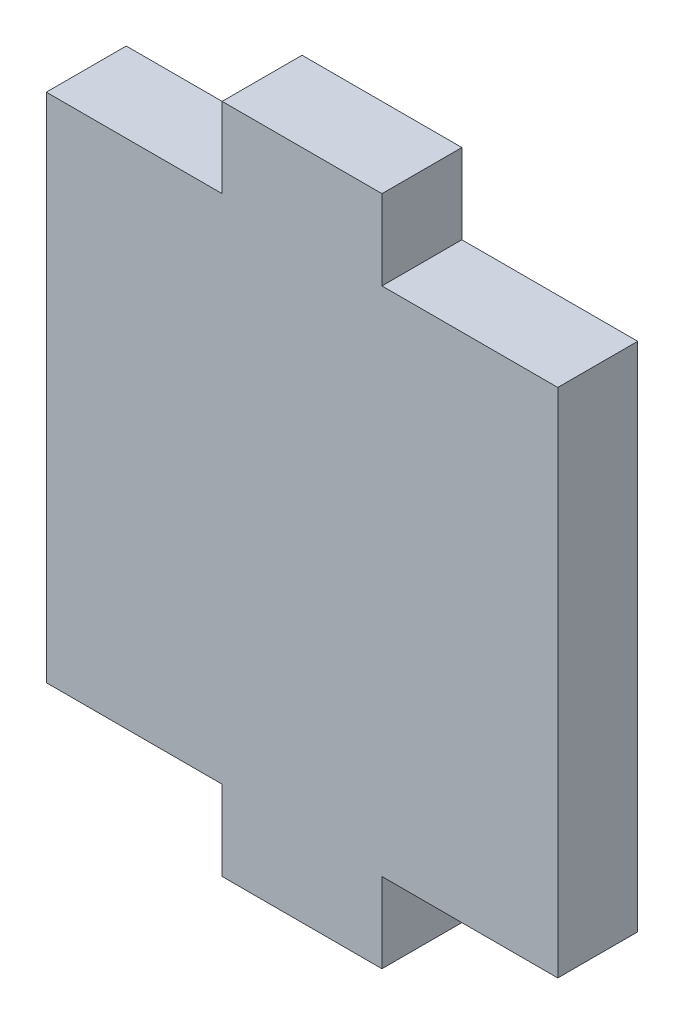
ISO-10303-21;
HEADER;
FILE_DESCRIPTION(('STEP AP214'),'2;1');
FILE_NAME('part.step','',(''),(''),'','','');
FILE_SCHEMA(('AUTOMOTIVE_DESIGN { 1 0 10303 214 1 1 1 1 }'));
ENDSEC;
DATA;
#1=APPLICATION_CONTEXT('core data for automotive mechanical design processes');
#2=APPLICATION_PROTOCOL_DEFINITION('international standard','automotive_design',2000,#1);
#3=PRODUCT_CONTEXT('',#1,'mechanical');
#4=PRODUCT('Part','Part','',(#3));
#5=PRODUCT_RELATED_PRODUCT_CATEGORY('part','',(#4));
#6=PRODUCT_DEFINITION_FORMATION('','',#4);
#7=PRODUCT_DEFINITION_CONTEXT('part definition',#1,'design');
#8=PRODUCT_DEFINITION('design','',#6,#7);
#9=PRODUCT_DEFINITION_SHAPE('','',#8);
#10=(LENGTH_UNIT() NAMED_UNIT(*) SI_UNIT(.MILLI.,.METRE.));
#11=(NAMED_UNIT(*) PLANE_ANGLE_UNIT() SI_UNIT($,.RADIAN.));
#12=(NAMED_UNIT(*) SI_UNIT($,.STERADIAN.) SOLID_ANGLE_UNIT());
#13=UNCERTAINTY_MEASURE_WITH_UNIT(LENGTH_MEASURE(1.E-05),#10,'distance_accuracy_value','');
#14=(GEOMETRIC_REPRESENTATION_CONTEXT(3) GLOBAL_UNCERTAINTY_ASSIGNED_CONTEXT((#13)) GLOBAL_UNIT_ASSIGNED_CONTEXT((#10,
#11,#12)) REPRESENTATION_CONTEXT('',''));
#15=CARTESIAN_POINT('',(0.,0.,0.));
#16=DIRECTION('',(0.,0.,1.));
#17=DIRECTION('',(1.,0.,0.));
#18=AXIS2_PLACEMENT_3D('',#15,#16,#17);
#19=CARTESIAN_POINT('',(-10.16,9.36625,3.175));
#20=DIRECTION('',(1.,0.,0.));
#21=DIRECTION('',(0.,1.,0.));
#22=AXIS2_PLACEMENT_3D('',#19,#20,#21);
#23=PLANE('',#22);
#24=DIRECTION('',(0.,-1.,0.));
#25=VECTOR('',#24,1.);
#26=CARTESIAN_POINT('',(-10.16,9.36625,0.));
#27=LINE('',#26,#25);
#28=CARTESIAN_POINT('',(-10.16,9.36625,0.));
#29=VERTEX_POINT('',#28);
#30=CARTESIAN_POINT('',(-10.16,-10.95375,0.));
#31=VERTEX_POINT('',#30);
#32=EDGE_CURVE('E155',#29,#31,#27,.T.);
#33=ORIENTED_EDGE('',*,*,#32,.T.);
#34=DIRECTION('',(0.,0.,-1.));
#35=VECTOR('',#34,1.);
#36=CARTESIAN_POINT('',(-10.16,-10.95375,3.175));
#37=LINE('',#36,#35);
#38=CARTESIAN_POINT('',(-10.16,-10.95375,3.175));
#39=VERTEX_POINT('',#38);
#40=EDGE_CURVE('E11',#39,#31,#37,.T.);
#41=ORIENTED_EDGE('',*,*,#40,.F.);
#42=DIRECTION('',(0.,-1.,0.));
#43=VECTOR('',#42,1.);
#44=CARTESIAN_POINT('',(-10.16,9.36625,3.175));
#45=LINE('',#44,#43);
#46=CARTESIAN_POINT('',(-10.16,9.36625,3.175));
#47=VERTEX_POINT('',#46);
#48=EDGE_CURVE('E177',#47,#39,#45,.T.);
#49=ORIENTED_EDGE('',*,*,#48,.F.);
#50=DIRECTION('',(0.,0.,-1.));
#51=VECTOR('',#50,1.);
#52=CARTESIAN_POINT('',(-10.16,9.36625,3.175));
#53=LINE('',#52,#51);
#54=EDGE_CURVE('E151',#47,#29,#53,.T.);
#55=ORIENTED_EDGE('',*,*,#54,.T.);
#56=EDGE_LOOP('',(#33,#41,#49,#55));
#57=FACE_BOUND('',#56,.T.);
#58=ADVANCED_FACE('F35',(#57),#23,.F.);
#59=CARTESIAN_POINT('',(-10.16,-10.95375,3.175));
#60=DIRECTION('',(0.,1.,0.));
#61=DIRECTION('',(-1.,0.,0.));
#62=AXIS2_PLACEMENT_3D('',#59,#60,#61);
#63=PLANE('',#62);
#64=DIRECTION('',(1.,0.,0.));
#65=VECTOR('',#64,1.);
#66=CARTESIAN_POINT('',(-10.16,-10.95375,0.));
#67=LINE('',#66,#65);
#68=CARTESIAN_POINT('',(-3.17500000000001,-10.95375,0.));
#69=VERTEX_POINT('',#68);
#70=EDGE_CURVE('E158',#31,#69,#67,.T.);
#71=ORIENTED_EDGE('',*,*,#70,.T.);
#72=DIRECTION('',(0.,0.,-1.));
#73=VECTOR('',#72,1.);
#74=CARTESIAN_POINT('',(-3.17500000000001,-10.95375,3.175));
#75=LINE('',#74,#73);
#76=CARTESIAN_POINT('',(-3.17500000000001,-10.95375,3.175));
#77=VERTEX_POINT('',#76);
#78=EDGE_CURVE('E43',#77,#69,#75,.T.);
#79=ORIENTED_EDGE('',*,*,#78,.F.);
#80=DIRECTION('',(1.,0.,0.));
#81=VECTOR('',#80,1.);
#82=CARTESIAN_POINT('',(-10.16,-10.95375,3.175));
#83=LINE('',#82,#81);
#84=EDGE_CURVE('E106',#39,#77,#83,.T.);
#85=ORIENTED_EDGE('',*,*,#84,.F.);
#86=ORIENTED_EDGE('',*,*,#40,.T.);
#87=EDGE_LOOP('',(#71,#79,#85,#86));
#88=FACE_BOUND('',#87,.T.);
#89=ADVANCED_FACE('F255',(#88),#63,.F.);
#90=CARTESIAN_POINT('',(-3.17500000000001,-10.95375,3.175));
#91=DIRECTION('',(1.,0.,0.));
#92=DIRECTION('',(0.,1.,0.));
#93=AXIS2_PLACEMENT_3D('',#90,#91,#92);
#94=PLANE('',#93);
#95=DIRECTION('',(0.,-1.,0.));
#96=VECTOR('',#95,1.);
#97=CARTESIAN_POINT('',(-3.17500000000001,-10.95375,0.));
#98=LINE('',#97,#96);
#99=CARTESIAN_POINT('',(-3.175,-14.12875,0.));
#100=VERTEX_POINT('',#99);
#101=EDGE_CURVE('E160',#69,#100,#98,.T.);
#102=ORIENTED_EDGE('',*,*,#101,.T.);
#103=DIRECTION('',(0.,0.,-1.));
#104=VECTOR('',#103,1.);
#105=CARTESIAN_POINT('',(-3.175,-14.12875,3.175));
#106=LINE('',#105,#104);
#107=CARTESIAN_POINT('',(-3.175,-14.12875,3.175));
#108=VERTEX_POINT('',#107);
#109=EDGE_CURVE('E196',#108,#100,#106,.T.);
#110=ORIENTED_EDGE('',*,*,#109,.F.);
#111=DIRECTION('',(0.,-1.,0.));
#112=VECTOR('',#111,1.);
#113=CARTESIAN_POINT('',(-3.17500000000001,-10.95375,3.175));
#114=LINE('',#113,#112);
#115=EDGE_CURVE('E204',#77,#108,#114,.T.);
#116=ORIENTED_EDGE('',*,*,#115,.F.);
#117=ORIENTED_EDGE('',*,*,#78,.T.);
#118=EDGE_LOOP('',(#102,#110,#116,#117));
#119=FACE_BOUND('',#118,.T.);
#120=ADVANCED_FACE('F202',(#119),#94,.F.);
#121=CARTESIAN_POINT('',(-3.175,-14.12875,3.175));
#122=DIRECTION('',(0.,1.,0.));
#123=DIRECTION('',(-1.,0.,0.));
#124=AXIS2_PLACEMENT_3D('',#121,#122,#123);
#125=PLANE('',#124);
#126=DIRECTION('',(1.,0.,0.));
#127=VECTOR('',#126,1.);
#128=CARTESIAN_POINT('',(-3.175,-14.12875,0.));
#129=LINE('',#128,#127);
#130=CARTESIAN_POINT('',(3.175,-14.12875,0.));
#131=VERTEX_POINT('',#130);
#132=EDGE_CURVE('E162',#100,#131,#129,.T.);
#133=ORIENTED_EDGE('',*,*,#132,.T.);
#134=DIRECTION('',(0.,0.,-1.));
#135=VECTOR('',#134,1.);
#136=CARTESIAN_POINT('',(3.175,-14.12875,3.175));
#137=LINE('',#136,#135);
#138=CARTESIAN_POINT('',(3.175,-14.12875,3.175));
#139=VERTEX_POINT('',#138);
#140=EDGE_CURVE('E193',#139,#131,#137,.T.);
#141=ORIENTED_EDGE('',*,*,#140,.F.);
#142=DIRECTION('',(1.,0.,0.));
#143=VECTOR('',#142,1.);
#144=CARTESIAN_POINT('',(-3.175,-14.12875,3.175));
#145=LINE('',#144,#143);
#146=EDGE_CURVE('E222',#108,#139,#145,.T.);
#147=ORIENTED_EDGE('',*,*,#146,.F.);
#148=ORIENTED_EDGE('',*,*,#109,.T.);
#149=EDGE_LOOP('',(#133,#141,#147,#148));
#150=FACE_BOUND('',#149,.T.);
#151=ADVANCED_FACE('F213',(#150),#125,.F.);
#152=CARTESIAN_POINT('',(3.175,-14.12875,3.175));
#153=DIRECTION('',(-1.,0.,0.));
#154=DIRECTION('',(0.,-1.,0.));
#155=AXIS2_PLACEMENT_3D('',#152,#153,#154);
#156=PLANE('',#155);
#157=DIRECTION('',(0.,1.,0.));
#158=VECTOR('',#157,1.);
#159=CARTESIAN_POINT('',(3.175,-14.12875,0.));
#160=LINE('',#159,#158);
#161=CARTESIAN_POINT('',(3.175,-10.95375,0.));
#162=VERTEX_POINT('',#161);
#163=EDGE_CURVE('E164',#131,#162,#160,.T.);
#164=ORIENTED_EDGE('',*,*,#163,.T.);
#165=DIRECTION('',(0.,0.,-1.));
#166=VECTOR('',#165,1.);
#167=CARTESIAN_POINT('',(3.175,-10.95375,3.175));
#168=LINE('',#167,#166);
#169=CARTESIAN_POINT('',(3.175,-10.95375,3.175));
#170=VERTEX_POINT('',#169);
#171=EDGE_CURVE('E190',#170,#162,#168,.T.);
#172=ORIENTED_EDGE('',*,*,#171,.F.);
#173=DIRECTION('',(0.,1.,0.));
#174=VECTOR('',#173,1.);
#175=CARTESIAN_POINT('',(3.175,-14.12875,3.175));
#176=LINE('',#175,#174);
#177=EDGE_CURVE('E219',#139,#170,#176,.T.);
#178=ORIENTED_EDGE('',*,*,#177,.F.);
#179=ORIENTED_EDGE('',*,*,#140,.T.);
#180=EDGE_LOOP('',(#164,#172,#178,#179));
#181=FACE_BOUND('',#180,.T.);
#182=ADVANCED_FACE('F217',(#181),#156,.F.);
#183=CARTESIAN_POINT('',(3.175,-10.95375,3.175));
#184=DIRECTION('',(0.,1.,0.));
#185=DIRECTION('',(-1.,0.,0.));
#186=AXIS2_PLACEMENT_3D('',#183,#184,#185);
#187=PLANE('',#186);
#188=DIRECTION('',(1.,0.,0.));
#189=VECTOR('',#188,1.);
#190=CARTESIAN_POINT('',(3.175,-10.95375,0.));
#191=LINE('',#190,#189);
#192=CARTESIAN_POINT('',(10.16,-10.95375,0.));
#193=VERTEX_POINT('',#192);
#194=EDGE_CURVE('E166',#162,#193,#191,.T.);
#195=ORIENTED_EDGE('',*,*,#194,.T.);
#196=DIRECTION('',(0.,0.,-1.));
#197=VECTOR('',#196,1.);
#198=CARTESIAN_POINT('',(10.16,-10.95375,3.175));
#199=LINE('',#198,#197);
#200=CARTESIAN_POINT('',(10.16,-10.95375,3.175));
#201=VERTEX_POINT('',#200);
#202=EDGE_CURVE('E187',#201,#193,#199,.T.);
#203=ORIENTED_EDGE('',*,*,#202,.F.);
#204=DIRECTION('',(1.,0.,0.));
#205=VECTOR('',#204,1.);
#206=CARTESIAN_POINT('',(3.175,-10.95375,3.175));
#207=LINE('',#206,#205);
#208=EDGE_CURVE('E221',#170,#201,#207,.T.);
#209=ORIENTED_EDGE('',*,*,#208,.F.);
#210=ORIENTED_EDGE('',*,*,#171,.T.);
#211=EDGE_LOOP('',(#195,#203,#209,#210));
#212=FACE_BOUND('',#211,.T.);
#213=ADVANCED_FACE('F268',(#212),#187,.F.);
#214=CARTESIAN_POINT('',(10.16,-10.95375,3.175));
#215=DIRECTION('',(-1.,0.,0.));
#216=DIRECTION('',(0.,-1.,0.));
#217=AXIS2_PLACEMENT_3D('',#214,#215,#216);
#218=PLANE('',#217);
#219=DIRECTION('',(0.,1.,0.));
#220=VECTOR('',#219,1.);
#221=CARTESIAN_POINT('',(10.16,-10.95375,0.));
#222=LINE('',#221,#220);
#223=CARTESIAN_POINT('',(10.16,9.36624999999999,0.));
#224=VERTEX_POINT('',#223);
#225=EDGE_CURVE('E168',#193,#224,#222,.T.);
#226=ORIENTED_EDGE('',*,*,#225,.T.);
#227=DIRECTION('',(0.,0.,-1.));
#228=VECTOR('',#227,1.);
#229=CARTESIAN_POINT('',(10.16,9.36624999999999,3.175));
#230=LINE('',#229,#228);
#231=CARTESIAN_POINT('',(10.16,9.36624999999999,3.175));
#232=VERTEX_POINT('',#231);
#233=EDGE_CURVE('E184',#232,#224,#230,.T.);
#234=ORIENTED_EDGE('',*,*,#233,.F.);
#235=DIRECTION('',(0.,1.,0.));
#236=VECTOR('',#235,1.);
#237=CARTESIAN_POINT('',(10.16,-10.95375,3.175));
#238=LINE('',#237,#236);
#239=EDGE_CURVE('E224',#201,#232,#238,.T.);
#240=ORIENTED_EDGE('',*,*,#239,.F.);
#241=ORIENTED_EDGE('',*,*,#202,.T.);
#242=EDGE_LOOP('',(#226,#234,#240,#241));
#243=FACE_BOUND('',#242,.T.);
#244=ADVANCED_FACE('F271',(#243),#218,.F.);
#245=CARTESIAN_POINT('',(3.17499999999999,9.36625,3.175));
#246=DIRECTION('',(0.,-1.,0.));
#247=DIRECTION('',(1.,0.,0.));
#248=AXIS2_PLACEMENT_3D('',#245,#246,#247);
#249=PLANE('',#248);
#250=DIRECTION('',(-1.,0.,0.));
#251=VECTOR('',#250,1.);
#252=CARTESIAN_POINT('',(3.17499999999999,9.36625,0.));
#253=LINE('',#252,#251);
#254=CARTESIAN_POINT('',(3.17499999999999,9.36625,0.));
#255=VERTEX_POINT('',#254);
#256=EDGE_CURVE('E170',#224,#255,#253,.T.);
#257=ORIENTED_EDGE('',*,*,#256,.T.);
#258=DIRECTION('',(0.,0.,-1.));
#259=VECTOR('',#258,1.);
#260=CARTESIAN_POINT('',(3.17499999999999,9.36625,3.175));
#261=LINE('',#260,#259);
#262=CARTESIAN_POINT('',(3.17499999999999,9.36625,3.175));
#263=VERTEX_POINT('',#262);
#264=EDGE_CURVE('E181',#263,#255,#261,.T.);
#265=ORIENTED_EDGE('',*,*,#264,.F.);
#266=DIRECTION('',(-1.,0.,0.));
#267=VECTOR('',#266,1.);
#268=CARTESIAN_POINT('',(3.17499999999999,9.36625,3.175));
#269=LINE('',#268,#267);
#270=EDGE_CURVE('E230',#232,#263,#269,.T.);
#271=ORIENTED_EDGE('',*,*,#270,.F.);
#272=ORIENTED_EDGE('',*,*,#233,.T.);
#273=EDGE_LOOP('',(#257,#265,#271,#272));
#274=FACE_BOUND('',#273,.T.);
#275=ADVANCED_FACE('F236',(#274),#249,.F.);
#276=CARTESIAN_POINT('',(3.17499999999999,12.54125,3.175));
#277=DIRECTION('',(-1.,0.,0.));
#278=DIRECTION('',(0.,-1.,0.));
#279=AXIS2_PLACEMENT_3D('',#276,#277,#278);
#280=PLANE('',#279);
#281=DIRECTION('',(0.,1.,0.));
#282=VECTOR('',#281,1.);
#283=CARTESIAN_POINT('',(3.17499999999999,12.54125,0.));
#284=LINE('',#283,#282);
#285=CARTESIAN_POINT('',(3.17499999999999,12.54125,0.));
#286=VERTEX_POINT('',#285);
#287=EDGE_CURVE('E172',#255,#286,#284,.T.);
#288=ORIENTED_EDGE('',*,*,#287,.T.);
#289=DIRECTION('',(0.,0.,-1.));
#290=VECTOR('',#289,1.);
#291=CARTESIAN_POINT('',(3.17499999999999,12.54125,3.175));
#292=LINE('',#291,#290);
#293=CARTESIAN_POINT('',(3.17499999999999,12.54125,3.175));
#294=VERTEX_POINT('',#293);
#295=EDGE_CURVE('E146',#294,#286,#292,.T.);
#296=ORIENTED_EDGE('',*,*,#295,.F.);
#297=DIRECTION('',(0.,1.,0.));
#298=VECTOR('',#297,1.);
#299=CARTESIAN_POINT('',(3.17499999999999,12.54125,3.175));
#300=LINE('',#299,#298);
#301=EDGE_CURVE('E137',#263,#294,#300,.T.);
#302=ORIENTED_EDGE('',*,*,#301,.F.);
#303=ORIENTED_EDGE('',*,*,#264,.T.);
#304=EDGE_LOOP('',(#288,#296,#302,#303));
#305=FACE_BOUND('',#304,.T.);
#306=ADVANCED_FACE('F240',(#305),#280,.F.);
#307=CARTESIAN_POINT('',(-3.17500000000001,12.54125,3.175));
#308=DIRECTION('',(0.,-1.,0.));
#309=DIRECTION('',(0.,0.,-1.));
#310=AXIS2_PLACEMENT_3D('',#307,#308,#309);
#311=PLANE('',#310);
#312=DIRECTION('',(-1.,0.,0.));
#313=VECTOR('',#312,1.);
#314=CARTESIAN_POINT('',(-3.17500000000001,12.54125,0.));
#315=LINE('',#314,#313);
#316=CARTESIAN_POINT('',(-3.17500000000001,12.54125,0.));
#317=VERTEX_POINT('',#316);
#318=EDGE_CURVE('E145',#286,#317,#315,.T.);
#319=ORIENTED_EDGE('',*,*,#318,.T.);
#320=DIRECTION('',(0.,0.,-1.));
#321=VECTOR('',#320,1.);
#322=CARTESIAN_POINT('',(-3.17500000000001,12.54125,3.175));
#323=LINE('',#322,#321);
#324=CARTESIAN_POINT('',(-3.17500000000001,12.54125,3.175));
#325=VERTEX_POINT('',#324);
#326=EDGE_CURVE('E142',#325,#317,#323,.T.);
#327=ORIENTED_EDGE('',*,*,#326,.F.);
#328=DIRECTION('',(-1.,0.,0.));
#329=VECTOR('',#328,1.);
#330=CARTESIAN_POINT('',(-3.17500000000001,12.54125,3.175));
#331=LINE('',#330,#329);
#332=EDGE_CURVE('E131',#294,#325,#331,.T.);
#333=ORIENTED_EDGE('',*,*,#332,.F.);
#334=ORIENTED_EDGE('',*,*,#295,.T.);
#335=EDGE_LOOP('',(#319,#327,#333,#334));
#336=FACE_BOUND('',#335,.T.);
#337=ADVANCED_FACE('F143',(#336),#311,.F.);
#338=CARTESIAN_POINT('',(-3.17500000000001,12.54125,3.175));
#339=DIRECTION('',(1.,0.,0.));
#340=DIRECTION('',(0.,1.,0.));
#341=AXIS2_PLACEMENT_3D('',#338,#339,#340);
#342=PLANE('',#341);
#343=DIRECTION('',(0.,-1.,0.));
#344=VECTOR('',#343,1.);
#345=CARTESIAN_POINT('',(-3.17500000000001,12.54125,0.));
#346=LINE('',#345,#344);
#347=CARTESIAN_POINT('',(-3.17500000000001,9.36625,0.));
#348=VERTEX_POINT('',#347);
#349=EDGE_CURVE('E92',#317,#348,#346,.T.);
#350=ORIENTED_EDGE('',*,*,#349,.T.);
#351=DIRECTION('',(0.,0.,-1.));
#352=VECTOR('',#351,1.);
#353=CARTESIAN_POINT('',(-3.17500000000001,9.36625,3.175));
#354=LINE('',#353,#352);
#355=CARTESIAN_POINT('',(-3.17500000000001,9.36625,3.175));
#356=VERTEX_POINT('',#355);
#357=EDGE_CURVE('E147',#356,#348,#354,.T.);
#358=ORIENTED_EDGE('',*,*,#357,.F.);
#359=DIRECTION('',(0.,-1.,0.));
#360=VECTOR('',#359,1.);
#361=CARTESIAN_POINT('',(-3.17500000000001,12.54125,3.175));
#362=LINE('',#361,#360);
#363=EDGE_CURVE('E135',#325,#356,#362,.T.);
#364=ORIENTED_EDGE('',*,*,#363,.F.);
#365=ORIENTED_EDGE('',*,*,#326,.T.);
#366=EDGE_LOOP('',(#350,#358,#364,#365));
#367=FACE_BOUND('',#366,.T.);
#368=ADVANCED_FACE('F149',(#367),#342,.F.);
#369=CARTESIAN_POINT('',(-3.17500000000001,9.36625,3.175));
#370=DIRECTION('',(0.,-1.,0.));
#371=DIRECTION('',(1.,0.,0.));
#372=AXIS2_PLACEMENT_3D('',#369,#370,#371);
#373=PLANE('',#372);
#374=DIRECTION('',(-1.,0.,0.));
#375=VECTOR('',#374,1.);
#376=CARTESIAN_POINT('',(-3.17500000000001,9.36625,0.));
#377=LINE('',#376,#375);
#378=EDGE_CURVE('E98',#348,#29,#377,.T.);
#379=ORIENTED_EDGE('',*,*,#378,.T.);
#380=ORIENTED_EDGE('',*,*,#54,.F.);
#381=DIRECTION('',(-1.,0.,0.));
#382=VECTOR('',#381,1.);
#383=CARTESIAN_POINT('',(-3.17500000000001,9.36625,3.175));
#384=LINE('',#383,#382);
#385=EDGE_CURVE('E51',#356,#47,#384,.T.);
#386=ORIENTED_EDGE('',*,*,#385,.F.);
#387=ORIENTED_EDGE('',*,*,#357,.T.);
#388=EDGE_LOOP('',(#379,#380,#386,#387));
#389=FACE_BOUND('',#388,.T.);
#390=ADVANCED_FACE('F244',(#389),#373,.F.);
#391=CARTESIAN_POINT('',(0.,0.,3.175));
#392=DIRECTION('',(0.,0.,1.));
#393=DIRECTION('',(1.,0.,0.));
#394=AXIS2_PLACEMENT_3D('',#391,#392,#393);
#395=PLANE('',#394);
#396=ORIENTED_EDGE('',*,*,#48,.T.);
#397=ORIENTED_EDGE('',*,*,#84,.T.);
#398=ORIENTED_EDGE('',*,*,#115,.T.);
#399=ORIENTED_EDGE('',*,*,#146,.T.);
#400=ORIENTED_EDGE('',*,*,#177,.T.);
#401=ORIENTED_EDGE('',*,*,#208,.T.);
#402=ORIENTED_EDGE('',*,*,#239,.T.);
#403=ORIENTED_EDGE('',*,*,#270,.T.);
#404=ORIENTED_EDGE('',*,*,#301,.T.);
#405=ORIENTED_EDGE('',*,*,#332,.T.);
#406=ORIENTED_EDGE('',*,*,#363,.T.);
#407=ORIENTED_EDGE('',*,*,#385,.T.);
#408=EDGE_LOOP('',(#396,#397,#398,#399,#400,#401,#402,#403,#404,#405,#406,#407));
#409=FACE_BOUND('',#408,.T.);
#410=ADVANCED_FACE('F133',(#409),#395,.T.);
#411=CARTESIAN_POINT('',(0.,0.,0.));
#412=DIRECTION('',(0.,0.,1.));
#413=DIRECTION('',(1.,0.,0.));
#414=AXIS2_PLACEMENT_3D('',#411,#412,#413);
#415=PLANE('',#414);
#416=ORIENTED_EDGE('',*,*,#32,.F.);
#417=ORIENTED_EDGE('',*,*,#378,.F.);
#418=ORIENTED_EDGE('',*,*,#349,.F.);
#419=ORIENTED_EDGE('',*,*,#318,.F.);
#420=ORIENTED_EDGE('',*,*,#287,.F.);
#421=ORIENTED_EDGE('',*,*,#256,.F.);
#422=ORIENTED_EDGE('',*,*,#225,.F.);
#423=ORIENTED_EDGE('',*,*,#194,.F.);
#424=ORIENTED_EDGE('',*,*,#163,.F.);
#425=ORIENTED_EDGE('',*,*,#132,.F.);
#426=ORIENTED_EDGE('',*,*,#101,.F.);
#427=ORIENTED_EDGE('',*,*,#70,.F.);
#428=EDGE_LOOP('',(#416,#417,#418,#419,#420,#421,#422,#423,#424,#425,#426,#427));
#429=FACE_BOUND('',#428,.T.);
#430=ADVANCED_FACE('F208',(#429),#415,.F.);
#431=CLOSED_SHELL('',(#58,#89,#120,#151,#182,#213,#244,#275,#306,#337,#368,#390,#410,#430));
#432=MANIFOLD_SOLID_BREP('B2',#431);
#433=ADVANCED_BREP_SHAPE_REPRESENTATION('',(#18,#432),#14);
#434=SHAPE_DEFINITION_REPRESENTATION(#9,#433);
ENDSEC;
END-ISO-10303-21;
